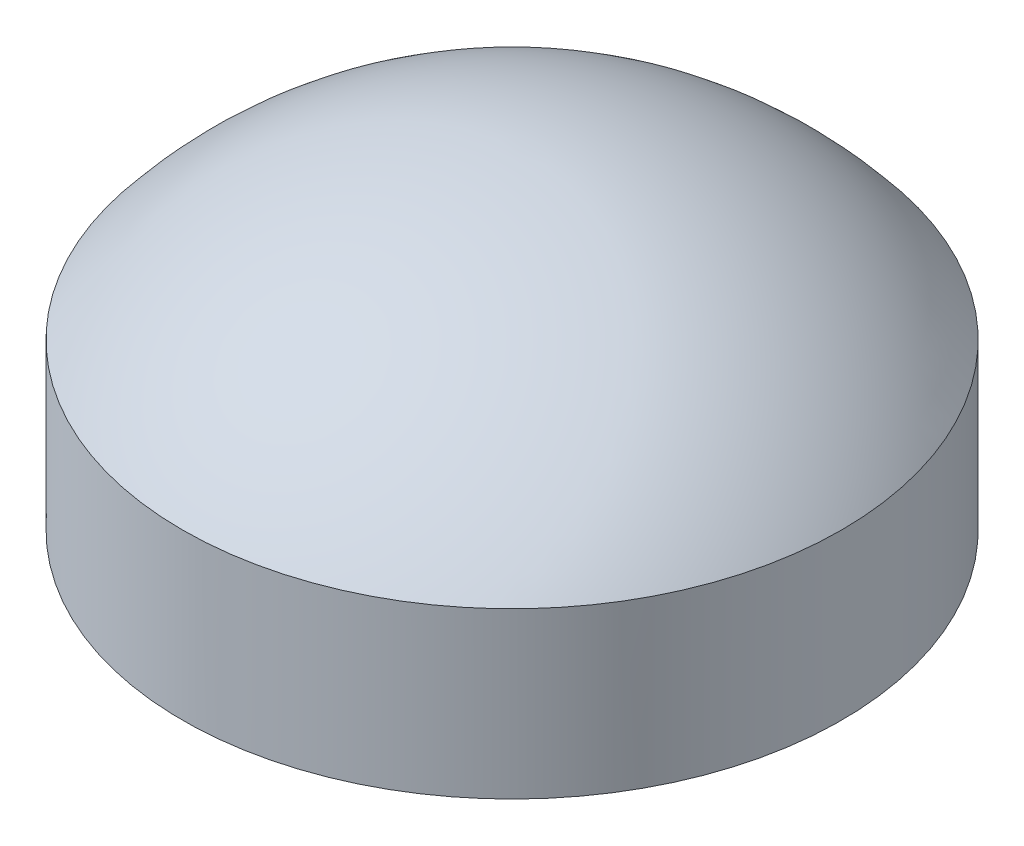
ISO-10303-21;
HEADER;
FILE_DESCRIPTION(('STEP AP214'),'2;1');
FILE_NAME('part.step','',(''),(''),'','','');
FILE_SCHEMA(('AUTOMOTIVE_DESIGN { 1 0 10303 214 1 1 1 1 }'));
ENDSEC;
DATA;
#1=APPLICATION_CONTEXT('core data for automotive mechanical design processes');
#2=APPLICATION_PROTOCOL_DEFINITION('international standard','automotive_design',2000,#1);
#3=PRODUCT_CONTEXT('',#1,'mechanical');
#4=PRODUCT('Part','Part','',(#3));
#5=PRODUCT_RELATED_PRODUCT_CATEGORY('part','',(#4));
#6=PRODUCT_DEFINITION_FORMATION('','',#4);
#7=PRODUCT_DEFINITION_CONTEXT('part definition',#1,'design');
#8=PRODUCT_DEFINITION('design','',#6,#7);
#9=PRODUCT_DEFINITION_SHAPE('','',#8);
#10=(LENGTH_UNIT() NAMED_UNIT(*) SI_UNIT(.MILLI.,.METRE.));
#11=(NAMED_UNIT(*) PLANE_ANGLE_UNIT() SI_UNIT($,.RADIAN.));
#12=(NAMED_UNIT(*) SI_UNIT($,.STERADIAN.) SOLID_ANGLE_UNIT());
#13=UNCERTAINTY_MEASURE_WITH_UNIT(LENGTH_MEASURE(1.E-05),#10,'distance_accuracy_value','');
#14=(GEOMETRIC_REPRESENTATION_CONTEXT(3) GLOBAL_UNCERTAINTY_ASSIGNED_CONTEXT((#13)) GLOBAL_UNIT_ASSIGNED_CONTEXT((#10,
#11,#12)) REPRESENTATION_CONTEXT('',''));
#15=CARTESIAN_POINT('',(0.,0.,0.));
#16=DIRECTION('',(0.,0.,1.));
#17=DIRECTION('',(1.,0.,0.));
#18=AXIS2_PLACEMENT_3D('',#15,#16,#17);
#19=CARTESIAN_POINT('',(0.,0.,0.));
#20=DIRECTION('',(0.,-1.,0.));
#21=DIRECTION('',(0.,0.,-1.));
#22=AXIS2_PLACEMENT_3D('',#19,#20,#21);
#23=CYLINDRICAL_SURFACE('',#22,50.8);
#24=CARTESIAN_POINT('',(0.,25.4,0.));
#25=DIRECTION('',(0.,-1.,0.));
#26=DIRECTION('',(0.,0.,-1.));
#27=AXIS2_PLACEMENT_3D('',#24,#25,#26);
#28=CIRCLE('',#27,50.8);
#29=CARTESIAN_POINT('',(0.,25.4,-50.8));
#30=VERTEX_POINT('',#29);
#31=EDGE_CURVE('E10',#30,#30,#28,.T.);
#32=ORIENTED_EDGE('',*,*,#31,.T.);
#33=EDGE_LOOP('',(#32));
#34=FACE_BOUND('',#33,.T.);
#35=CARTESIAN_POINT('',(0.,0.,0.));
#36=DIRECTION('',(0.,-1.,0.));
#37=DIRECTION('',(0.,0.,-1.));
#38=AXIS2_PLACEMENT_3D('',#35,#36,#37);
#39=CIRCLE('',#38,50.8);
#40=CARTESIAN_POINT('',(0.,0.,-50.8));
#41=VERTEX_POINT('',#40);
#42=EDGE_CURVE('E45',#41,#41,#39,.T.);
#43=ORIENTED_EDGE('',*,*,#42,.F.);
#44=EDGE_LOOP('',(#43));
#45=FACE_BOUND('',#44,.T.);
#46=ADVANCED_FACE('F31',(#34,#45),#23,.T.);
#47=CARTESIAN_POINT('',(0.,-15.,0.));
#48=DIRECTION('',(0.,-1.,0.));
#49=DIRECTION('',(1.,0.,0.));
#50=AXIS2_PLACEMENT_3D('',#47,#48,#49);
#51=SPHERICAL_SURFACE('',#50,64.9060860012372);
#52=ORIENTED_EDGE('',*,*,#31,.F.);
#53=EDGE_LOOP('',(#52));
#54=FACE_BOUND('',#53,.T.);
#55=ADVANCED_FACE('F55',(#54),#51,.T.);
#56=CARTESIAN_POINT('',(0.,-15.,0.));
#57=DIRECTION('',(0.,-1.,0.));
#58=DIRECTION('',(1.,0.,0.));
#59=AXIS2_PLACEMENT_3D('',#56,#57,#58);
#60=SPHERICAL_SURFACE('',#59,60.0663175165583);
#61=CARTESIAN_POINT('',(0.,25.4,0.));
#62=DIRECTION('',(0.,-1.,0.));
#63=DIRECTION('',(0.,0.,-1.));
#64=AXIS2_PLACEMENT_3D('',#61,#62,#63);
#65=CIRCLE('',#64,44.45);
#66=CARTESIAN_POINT('',(0.,25.4,-44.45));
#67=VERTEX_POINT('',#66);
#68=EDGE_CURVE('E37',#67,#67,#65,.T.);
#69=ORIENTED_EDGE('',*,*,#68,.T.);
#70=EDGE_LOOP('',(#69));
#71=FACE_BOUND('',#70,.T.);
#72=ADVANCED_FACE('F59',(#71),#60,.F.);
#73=CARTESIAN_POINT('',(0.,0.,0.));
#74=DIRECTION('',(0.,-1.,0.));
#75=DIRECTION('',(0.,0.,-1.));
#76=AXIS2_PLACEMENT_3D('',#73,#74,#75);
#77=CYLINDRICAL_SURFACE('',#76,44.45);
#78=ORIENTED_EDGE('',*,*,#68,.F.);
#79=EDGE_LOOP('',(#78));
#80=FACE_BOUND('',#79,.T.);
#81=CARTESIAN_POINT('',(0.,0.,0.));
#82=DIRECTION('',(0.,-1.,0.));
#83=DIRECTION('',(0.,0.,-1.));
#84=AXIS2_PLACEMENT_3D('',#81,#82,#83);
#85=CIRCLE('',#84,44.45);
#86=CARTESIAN_POINT('',(0.,0.,-44.45));
#87=VERTEX_POINT('',#86);
#88=EDGE_CURVE('E41',#87,#87,#85,.T.);
#89=ORIENTED_EDGE('',*,*,#88,.T.);
#90=EDGE_LOOP('',(#89));
#91=FACE_BOUND('',#90,.T.);
#92=ADVANCED_FACE('F64',(#80,#91),#77,.F.);
#93=CARTESIAN_POINT('',(0.,0.,0.));
#94=DIRECTION('',(0.,-1.,0.));
#95=DIRECTION('',(0.,0.,-1.));
#96=AXIS2_PLACEMENT_3D('',#93,#94,#95);
#97=PLANE('',#96);
#98=ORIENTED_EDGE('',*,*,#42,.T.);
#99=EDGE_LOOP('',(#98));
#100=FACE_BOUND('',#99,.T.);
#101=ORIENTED_EDGE('',*,*,#88,.F.);
#102=EDGE_LOOP('',(#101));
#103=FACE_BOUND('',#102,.T.);
#104=ADVANCED_FACE('F51',(#100,#103),#97,.T.);
#105=CLOSED_SHELL('',(#46,#55,#72,#92,#104));
#106=MANIFOLD_SOLID_BREP('B2',#105);
#107=ADVANCED_BREP_SHAPE_REPRESENTATION('',(#18,#106),#14);
#108=SHAPE_DEFINITION_REPRESENTATION(#9,#107);
ENDSEC;
END-ISO-10303-21;
